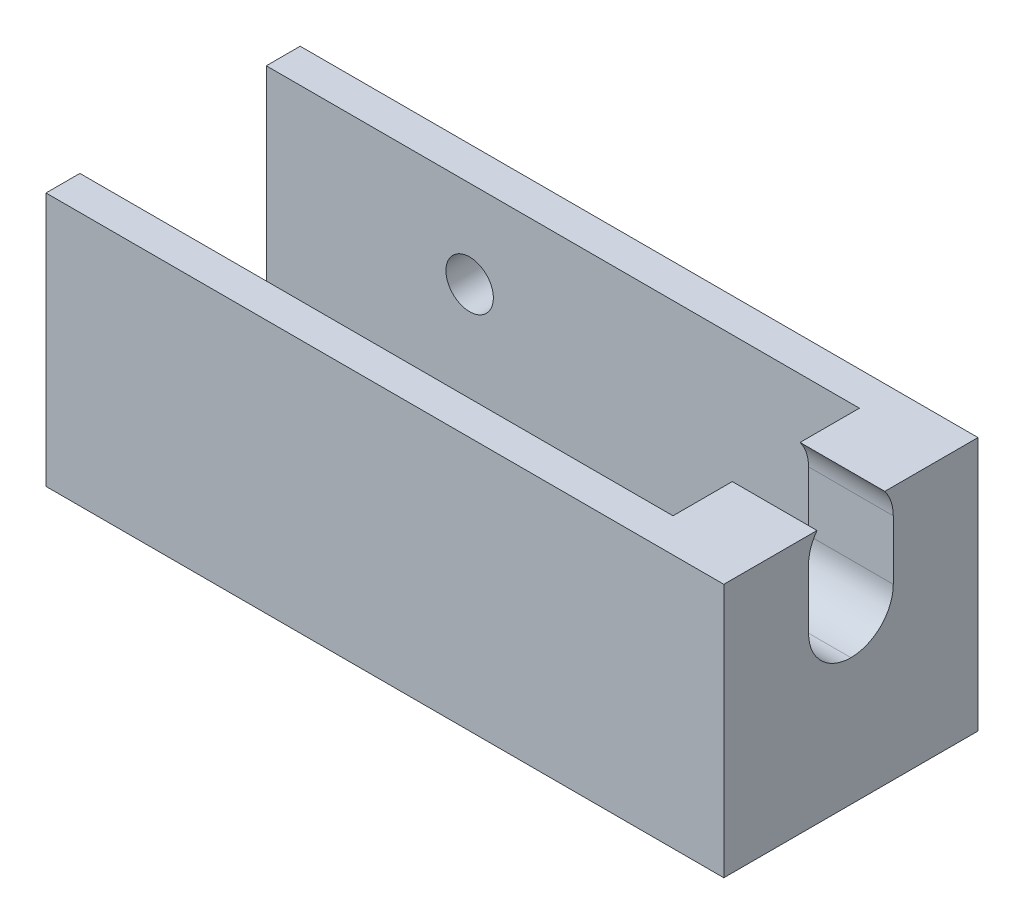
ISO-10303-21;
HEADER;
FILE_DESCRIPTION(('STEP AP214'),'2;1');
FILE_NAME('part.step','',(''),(''),'','','');
FILE_SCHEMA(('AUTOMOTIVE_DESIGN { 1 0 10303 214 1 1 1 1 }'));
ENDSEC;
DATA;
#1=APPLICATION_CONTEXT('core data for automotive mechanical design processes');
#2=APPLICATION_PROTOCOL_DEFINITION('international standard','automotive_design',2000,#1);
#3=PRODUCT_CONTEXT('',#1,'mechanical');
#4=PRODUCT('Part','Part','',(#3));
#5=PRODUCT_RELATED_PRODUCT_CATEGORY('part','',(#4));
#6=PRODUCT_DEFINITION_FORMATION('','',#4);
#7=PRODUCT_DEFINITION_CONTEXT('part definition',#1,'design');
#8=PRODUCT_DEFINITION('design','',#6,#7);
#9=PRODUCT_DEFINITION_SHAPE('','',#8);
#10=(LENGTH_UNIT() NAMED_UNIT(*) SI_UNIT(.MILLI.,.METRE.));
#11=(NAMED_UNIT(*) PLANE_ANGLE_UNIT() SI_UNIT($,.RADIAN.));
#12=(NAMED_UNIT(*) SI_UNIT($,.STERADIAN.) SOLID_ANGLE_UNIT());
#13=UNCERTAINTY_MEASURE_WITH_UNIT(LENGTH_MEASURE(1.E-05),#10,'distance_accuracy_value','');
#14=(GEOMETRIC_REPRESENTATION_CONTEXT(3) GLOBAL_UNCERTAINTY_ASSIGNED_CONTEXT((#13)) GLOBAL_UNIT_ASSIGNED_CONTEXT((#10,
#11,#12)) REPRESENTATION_CONTEXT('',''));
#15=CARTESIAN_POINT('',(0.,0.,0.));
#16=DIRECTION('',(0.,0.,1.));
#17=DIRECTION('',(1.,0.,0.));
#18=AXIS2_PLACEMENT_3D('',#15,#16,#17);
#19=CARTESIAN_POINT('',(15.,10.,0.));
#20=DIRECTION('',(1.,0.,0.));
#21=DIRECTION('',(0.,0.,-1.));
#22=AXIS2_PLACEMENT_3D('',#19,#20,#21);
#23=CYLINDRICAL_SURFACE('',#22,2.5);
#24=DIRECTION('',(-1.,0.,0.));
#25=VECTOR('',#24,1.);
#26=CARTESIAN_POINT('',(15.,10.,2.5));
#27=LINE('',#26,#25);
#28=CARTESIAN_POINT('',(20.,10.,2.5));
#29=VERTEX_POINT('',#28);
#30=CARTESIAN_POINT('',(15.,10.,2.5));
#31=VERTEX_POINT('',#30);
#32=EDGE_CURVE('E293',#29,#31,#27,.T.);
#33=ORIENTED_EDGE('',*,*,#32,.F.);
#34=CARTESIAN_POINT('',(20.,10.,0.));
#35=DIRECTION('',(-1.,0.,0.));
#36=DIRECTION('',(0.,0.,1.));
#37=AXIS2_PLACEMENT_3D('',#34,#35,#36);
#38=CIRCLE('',#37,2.5);
#39=CARTESIAN_POINT('',(20.,7.5,0.));
#40=VERTEX_POINT('',#39);
#41=EDGE_CURVE('E47',#29,#40,#38,.F.);
#42=ORIENTED_EDGE('',*,*,#41,.T.);
#43=DIRECTION('',(1.,0.,0.));
#44=VECTOR('',#43,1.);
#45=CARTESIAN_POINT('',(15.,7.5,0.));
#46=LINE('',#45,#44);
#47=CARTESIAN_POINT('',(15.,7.5,0.));
#48=VERTEX_POINT('',#47);
#49=EDGE_CURVE('E283',#40,#48,#46,.F.);
#50=ORIENTED_EDGE('',*,*,#49,.T.);
#51=CARTESIAN_POINT('',(15.,10.,0.));
#52=DIRECTION('',(1.,0.,0.));
#53=DIRECTION('',(0.,0.,-1.));
#54=AXIS2_PLACEMENT_3D('',#51,#52,#53);
#55=CIRCLE('',#54,2.5);
#56=EDGE_CURVE('E11',#48,#31,#55,.F.);
#57=ORIENTED_EDGE('',*,*,#56,.T.);
#58=EDGE_LOOP('',(#33,#42,#50,#57));
#59=FACE_BOUND('',#58,.T.);
#60=ADVANCED_FACE('F38',(#59),#23,.F.);
#61=CARTESIAN_POINT('',(15.,10.,0.));
#62=DIRECTION('',(-1.,0.,0.));
#63=DIRECTION('',(0.,0.,1.));
#64=AXIS2_PLACEMENT_3D('',#61,#62,#63);
#65=CYLINDRICAL_SURFACE('',#64,2.5);
#66=DIRECTION('',(1.,0.,0.));
#67=VECTOR('',#66,1.);
#68=CARTESIAN_POINT('',(15.,10.,-2.5));
#69=LINE('',#68,#67);
#70=CARTESIAN_POINT('',(15.,10.,-2.5));
#71=VERTEX_POINT('',#70);
#72=CARTESIAN_POINT('',(20.,10.,-2.5));
#73=VERTEX_POINT('',#72);
#74=EDGE_CURVE('E279',#71,#73,#69,.T.);
#75=ORIENTED_EDGE('',*,*,#74,.F.);
#76=CARTESIAN_POINT('',(15.,10.,0.));
#77=DIRECTION('',(1.,0.,0.));
#78=DIRECTION('',(0.,0.,-1.));
#79=AXIS2_PLACEMENT_3D('',#76,#77,#78);
#80=CIRCLE('',#79,2.5);
#81=EDGE_CURVE('E286',#71,#48,#80,.F.);
#82=ORIENTED_EDGE('',*,*,#81,.T.);
#83=ORIENTED_EDGE('',*,*,#49,.F.);
#84=CARTESIAN_POINT('',(20.,10.,0.));
#85=DIRECTION('',(-1.,0.,0.));
#86=DIRECTION('',(0.,0.,1.));
#87=AXIS2_PLACEMENT_3D('',#84,#85,#86);
#88=CIRCLE('',#87,2.5);
#89=EDGE_CURVE('E290',#40,#73,#88,.F.);
#90=ORIENTED_EDGE('',*,*,#89,.T.);
#91=EDGE_LOOP('',(#75,#82,#83,#90));
#92=FACE_BOUND('',#91,.T.);
#93=ADVANCED_FACE('F303',(#92),#65,.F.);
#94=CARTESIAN_POINT('',(0.,15.,0.));
#95=DIRECTION('',(0.,-1.,0.));
#96=DIRECTION('',(0.,0.,-1.));
#97=AXIS2_PLACEMENT_3D('',#94,#95,#96);
#98=PLANE('',#97);
#99=DIRECTION('',(1.,0.,0.));
#100=VECTOR('',#99,1.);
#101=CARTESIAN_POINT('',(15.,15.,2.));
#102=LINE('',#101,#100);
#103=CARTESIAN_POINT('',(20.,15.,2.));
#104=VERTEX_POINT('',#103);
#105=CARTESIAN_POINT('',(15.,15.,2.));
#106=VERTEX_POINT('',#105);
#107=EDGE_CURVE('E271',#104,#106,#102,.F.);
#108=ORIENTED_EDGE('',*,*,#107,.T.);
#109=DIRECTION('',(0.,0.,-1.));
#110=VECTOR('',#109,1.);
#111=CARTESIAN_POINT('',(15.,15.,-2.));
#112=LINE('',#111,#110);
#113=CARTESIAN_POINT('',(15.,15.,5.5));
#114=VERTEX_POINT('',#113);
#115=EDGE_CURVE('E156',#114,#106,#112,.T.);
#116=ORIENTED_EDGE('',*,*,#115,.F.);
#117=DIRECTION('',(1.,0.,0.));
#118=VECTOR('',#117,1.);
#119=CARTESIAN_POINT('',(-18.,15.,5.5));
#120=LINE('',#119,#118);
#121=CARTESIAN_POINT('',(-20.,15.,5.5));
#122=VERTEX_POINT('',#121);
#123=EDGE_CURVE('E182',#122,#114,#120,.T.);
#124=ORIENTED_EDGE('',*,*,#123,.F.);
#125=DIRECTION('',(0.,0.,1.));
#126=VECTOR('',#125,1.);
#127=CARTESIAN_POINT('',(-20.,15.,7.5));
#128=LINE('',#127,#126);
#129=CARTESIAN_POINT('',(-20.,15.,7.5));
#130=VERTEX_POINT('',#129);
#131=EDGE_CURVE('E236',#122,#130,#128,.T.);
#132=ORIENTED_EDGE('',*,*,#131,.T.);
#133=DIRECTION('',(1.,0.,0.));
#134=VECTOR('',#133,1.);
#135=CARTESIAN_POINT('',(-20.,15.,7.5));
#136=LINE('',#135,#134);
#137=CARTESIAN_POINT('',(20.,15.,7.5));
#138=VERTEX_POINT('',#137);
#139=EDGE_CURVE('E240',#130,#138,#136,.T.);
#140=ORIENTED_EDGE('',*,*,#139,.T.);
#141=DIRECTION('',(0.,0.,-1.));
#142=VECTOR('',#141,1.);
#143=CARTESIAN_POINT('',(20.,15.,7.5));
#144=LINE('',#143,#142);
#145=EDGE_CURVE('E228',#138,#104,#144,.T.);
#146=ORIENTED_EDGE('',*,*,#145,.T.);
#147=EDGE_LOOP('',(#108,#116,#124,#132,#140,#146));
#148=FACE_BOUND('',#147,.T.);
#149=ADVANCED_FACE('F318',(#148),#98,.F.);
#150=CARTESIAN_POINT('',(20.,15.,7.5));
#151=DIRECTION('',(-1.,0.,0.));
#152=DIRECTION('',(0.,0.,1.));
#153=AXIS2_PLACEMENT_3D('',#150,#151,#152);
#154=PLANE('',#153);
#155=DIRECTION('',(0.,-1.,0.));
#156=VECTOR('',#155,1.);
#157=CARTESIAN_POINT('',(20.,13.5,2.5));
#158=LINE('',#157,#156);
#159=CARTESIAN_POINT('',(20.,13.5,2.5));
#160=VERTEX_POINT('',#159);
#161=EDGE_CURVE('E213',#160,#29,#158,.T.);
#162=ORIENTED_EDGE('',*,*,#161,.F.);
#163=CARTESIAN_POINT('',(20.,13.5,0.));
#164=DIRECTION('',(1.,0.,0.));
#165=DIRECTION('',(0.,0.,-1.));
#166=AXIS2_PLACEMENT_3D('',#163,#164,#165);
#167=CIRCLE('',#166,2.5);
#168=EDGE_CURVE('E192',#104,#160,#167,.T.);
#169=ORIENTED_EDGE('',*,*,#168,.F.);
#170=ORIENTED_EDGE('',*,*,#145,.F.);
#171=DIRECTION('',(0.,-1.,0.));
#172=VECTOR('',#171,1.);
#173=CARTESIAN_POINT('',(20.,15.,7.5));
#174=LINE('',#173,#172);
#175=CARTESIAN_POINT('',(20.,0.,7.5));
#176=VERTEX_POINT('',#175);
#177=EDGE_CURVE('E243',#138,#176,#174,.T.);
#178=ORIENTED_EDGE('',*,*,#177,.T.);
#179=DIRECTION('',(0.,0.,-1.));
#180=VECTOR('',#179,1.);
#181=CARTESIAN_POINT('',(20.,0.,7.5));
#182=LINE('',#181,#180);
#183=CARTESIAN_POINT('',(20.,0.,-7.5));
#184=VERTEX_POINT('',#183);
#185=EDGE_CURVE('E224',#176,#184,#182,.T.);
#186=ORIENTED_EDGE('',*,*,#185,.T.);
#187=DIRECTION('',(0.,-1.,0.));
#188=VECTOR('',#187,1.);
#189=CARTESIAN_POINT('',(20.,15.,-7.5));
#190=LINE('',#189,#188);
#191=CARTESIAN_POINT('',(20.,15.,-7.5));
#192=VERTEX_POINT('',#191);
#193=EDGE_CURVE('E267',#192,#184,#190,.T.);
#194=ORIENTED_EDGE('',*,*,#193,.F.);
#195=CARTESIAN_POINT('',(20.,15.,-2.));
#196=VERTEX_POINT('',#195);
#197=EDGE_CURVE('E233',#196,#192,#144,.T.);
#198=ORIENTED_EDGE('',*,*,#197,.F.);
#199=CARTESIAN_POINT('',(20.,13.5,-2.5));
#200=VERTEX_POINT('',#199);
#201=EDGE_CURVE('E210',#200,#196,#167,.T.);
#202=ORIENTED_EDGE('',*,*,#201,.F.);
#203=DIRECTION('',(0.,1.,0.));
#204=VECTOR('',#203,1.);
#205=CARTESIAN_POINT('',(20.,7.5,-2.50000000000001));
#206=LINE('',#205,#204);
#207=EDGE_CURVE('E217',#73,#200,#206,.T.);
#208=ORIENTED_EDGE('',*,*,#207,.F.);
#209=ORIENTED_EDGE('',*,*,#89,.F.);
#210=ORIENTED_EDGE('',*,*,#41,.F.);
#211=EDGE_LOOP('',(#162,#169,#170,#178,#186,#194,#198,#202,#208,#209,#210));
#212=FACE_BOUND('',#211,.T.);
#213=ADVANCED_FACE('F299',(#212),#154,.F.);
#214=CARTESIAN_POINT('',(-20.,15.,-7.5));
#215=DIRECTION('',(0.,0.,1.));
#216=DIRECTION('',(1.,0.,0.));
#217=AXIS2_PLACEMENT_3D('',#214,#215,#216);
#218=PLANE('',#217);
#219=CARTESIAN_POINT('',(-8.,9.83148807816108,-7.49999999999999));
#220=DIRECTION('',(0.,0.,-1.));
#221=DIRECTION('',(-1.,0.,0.));
#222=AXIS2_PLACEMENT_3D('',#219,#220,#221);
#223=CIRCLE('',#222,1.4);
#224=CARTESIAN_POINT('',(-9.4,9.83148807816108,-7.49999999999999));
#225=VERTEX_POINT('',#224);
#226=EDGE_CURVE('E494',#225,#225,#223,.T.);
#227=ORIENTED_EDGE('',*,*,#226,.F.);
#228=EDGE_LOOP('',(#227));
#229=FACE_BOUND('',#228,.T.);
#230=DIRECTION('',(-1.,0.,0.));
#231=VECTOR('',#230,1.);
#232=CARTESIAN_POINT('',(-20.,0.,-7.5));
#233=LINE('',#232,#231);
#234=CARTESIAN_POINT('',(-20.,0.,-7.5));
#235=VERTEX_POINT('',#234);
#236=EDGE_CURVE('E247',#184,#235,#233,.T.);
#237=ORIENTED_EDGE('',*,*,#236,.T.);
#238=DIRECTION('',(0.,-1.,0.));
#239=VECTOR('',#238,1.);
#240=CARTESIAN_POINT('',(-20.,15.,-7.5));
#241=LINE('',#240,#239);
#242=CARTESIAN_POINT('',(-20.,15.,-7.5));
#243=VERTEX_POINT('',#242);
#244=EDGE_CURVE('E263',#243,#235,#241,.T.);
#245=ORIENTED_EDGE('',*,*,#244,.F.);
#246=DIRECTION('',(-1.,0.,0.));
#247=VECTOR('',#246,1.);
#248=CARTESIAN_POINT('',(-20.,15.,-7.5));
#249=LINE('',#248,#247);
#250=EDGE_CURVE('E232',#192,#243,#249,.T.);
#251=ORIENTED_EDGE('',*,*,#250,.F.);
#252=ORIENTED_EDGE('',*,*,#193,.T.);
#253=EDGE_LOOP('',(#237,#245,#251,#252));
#254=FACE_BOUND('',#253,.T.);
#255=ADVANCED_FACE('F335',(#229,#254),#218,.F.);
#256=CARTESIAN_POINT('',(-20.,15.,7.5));
#257=DIRECTION('',(1.,0.,0.));
#258=DIRECTION('',(0.,0.,-1.));
#259=AXIS2_PLACEMENT_3D('',#256,#257,#258);
#260=PLANE('',#259);
#261=ORIENTED_EDGE('',*,*,#131,.F.);
#262=DIRECTION('',(0.,1.,0.));
#263=VECTOR('',#262,1.);
#264=CARTESIAN_POINT('',(-20.,2.,5.5));
#265=LINE('',#264,#263);
#266=CARTESIAN_POINT('',(-20.,2.,5.5));
#267=VERTEX_POINT('',#266);
#268=EDGE_CURVE('E167',#267,#122,#265,.T.);
#269=ORIENTED_EDGE('',*,*,#268,.F.);
#270=DIRECTION('',(0.,0.,1.));
#271=VECTOR('',#270,1.);
#272=CARTESIAN_POINT('',(-20.,2.,-5.5));
#273=LINE('',#272,#271);
#274=CARTESIAN_POINT('',(-20.,2.,-5.5));
#275=VERTEX_POINT('',#274);
#276=EDGE_CURVE('E148',#275,#267,#273,.T.);
#277=ORIENTED_EDGE('',*,*,#276,.F.);
#278=DIRECTION('',(0.,1.,0.));
#279=VECTOR('',#278,1.);
#280=CARTESIAN_POINT('',(-20.,2.,-5.5));
#281=LINE('',#280,#279);
#282=CARTESIAN_POINT('',(-20.,15.,-5.5));
#283=VERTEX_POINT('',#282);
#284=EDGE_CURVE('E159',#275,#283,#281,.T.);
#285=ORIENTED_EDGE('',*,*,#284,.T.);
#286=EDGE_CURVE('E237',#243,#283,#128,.T.);
#287=ORIENTED_EDGE('',*,*,#286,.F.);
#288=ORIENTED_EDGE('',*,*,#244,.T.);
#289=DIRECTION('',(0.,0.,1.));
#290=VECTOR('',#289,1.);
#291=CARTESIAN_POINT('',(-20.,0.,7.5));
#292=LINE('',#291,#290);
#293=CARTESIAN_POINT('',(-20.,0.,7.5));
#294=VERTEX_POINT('',#293);
#295=EDGE_CURVE('E250',#235,#294,#292,.T.);
#296=ORIENTED_EDGE('',*,*,#295,.T.);
#297=DIRECTION('',(0.,-1.,0.));
#298=VECTOR('',#297,1.);
#299=CARTESIAN_POINT('',(-20.,15.,7.5));
#300=LINE('',#299,#298);
#301=EDGE_CURVE('E259',#130,#294,#300,.T.);
#302=ORIENTED_EDGE('',*,*,#301,.F.);
#303=EDGE_LOOP('',(#261,#269,#277,#285,#287,#288,#296,#302));
#304=FACE_BOUND('',#303,.T.);
#305=ADVANCED_FACE('F170',(#304),#260,.F.);
#306=CARTESIAN_POINT('',(-20.,15.,7.5));
#307=DIRECTION('',(0.,0.,-1.));
#308=DIRECTION('',(-1.,0.,0.));
#309=AXIS2_PLACEMENT_3D('',#306,#307,#308);
#310=PLANE('',#309);
#311=DIRECTION('',(1.,0.,0.));
#312=VECTOR('',#311,1.);
#313=CARTESIAN_POINT('',(-20.,0.,7.5));
#314=LINE('',#313,#312);
#315=EDGE_CURVE('E253',#294,#176,#314,.T.);
#316=ORIENTED_EDGE('',*,*,#315,.T.);
#317=ORIENTED_EDGE('',*,*,#177,.F.);
#318=ORIENTED_EDGE('',*,*,#139,.F.);
#319=ORIENTED_EDGE('',*,*,#301,.T.);
#320=EDGE_LOOP('',(#316,#317,#318,#319));
#321=FACE_BOUND('',#320,.T.);
#322=ADVANCED_FACE('F325',(#321),#310,.F.);
#323=DIRECTION('',(-1.,0.,0.));
#324=VECTOR('',#323,1.);
#325=CARTESIAN_POINT('',(-18.,15.,-5.5));
#326=LINE('',#325,#324);
#327=CARTESIAN_POINT('',(15.,15.,-5.5));
#328=VERTEX_POINT('',#327);
#329=EDGE_CURVE('E162',#328,#283,#326,.T.);
#330=ORIENTED_EDGE('',*,*,#329,.F.);
#331=CARTESIAN_POINT('',(15.,15.,-2.));
#332=VERTEX_POINT('',#331);
#333=EDGE_CURVE('E186',#332,#328,#112,.T.);
#334=ORIENTED_EDGE('',*,*,#333,.F.);
#335=DIRECTION('',(1.,0.,0.));
#336=VECTOR('',#335,1.);
#337=CARTESIAN_POINT('',(15.,15.,-2.));
#338=LINE('',#337,#336);
#339=EDGE_CURVE('E275',#332,#196,#338,.T.);
#340=ORIENTED_EDGE('',*,*,#339,.T.);
#341=ORIENTED_EDGE('',*,*,#197,.T.);
#342=ORIENTED_EDGE('',*,*,#250,.T.);
#343=ORIENTED_EDGE('',*,*,#286,.T.);
#344=EDGE_LOOP('',(#330,#334,#340,#341,#342,#343));
#345=FACE_BOUND('',#344,.T.);
#346=ADVANCED_FACE('F341',(#345),#98,.F.);
#347=CARTESIAN_POINT('',(0.,0.,0.));
#348=DIRECTION('',(0.,-1.,0.));
#349=DIRECTION('',(0.,0.,-1.));
#350=AXIS2_PLACEMENT_3D('',#347,#348,#349);
#351=PLANE('',#350);
#352=CARTESIAN_POINT('',(-15.9327001413857,0.,0.));
#353=DIRECTION('',(0.,-1.,0.));
#354=DIRECTION('',(0.,0.,-1.));
#355=AXIS2_PLACEMENT_3D('',#352,#353,#354);
#356=CIRCLE('',#355,1.);
#357=CARTESIAN_POINT('',(-15.9327001413857,0.,-1.));
#358=VERTEX_POINT('',#357);
#359=EDGE_CURVE('E487',#358,#358,#356,.T.);
#360=ORIENTED_EDGE('',*,*,#359,.F.);
#361=EDGE_LOOP('',(#360));
#362=FACE_BOUND('',#361,.T.);
#363=ORIENTED_EDGE('',*,*,#185,.F.);
#364=ORIENTED_EDGE('',*,*,#315,.F.);
#365=ORIENTED_EDGE('',*,*,#295,.F.);
#366=ORIENTED_EDGE('',*,*,#236,.F.);
#367=EDGE_LOOP('',(#363,#364,#365,#366));
#368=FACE_BOUND('',#367,.T.);
#369=ADVANCED_FACE('F330',(#362,#368),#351,.T.);
#370=CARTESIAN_POINT('',(15.,13.5,0.));
#371=DIRECTION('',(1.,0.,0.));
#372=DIRECTION('',(0.,0.,-1.));
#373=AXIS2_PLACEMENT_3D('',#370,#371,#372);
#374=CYLINDRICAL_SURFACE('',#373,2.5);
#375=CARTESIAN_POINT('',(15.,13.5,0.));
#376=DIRECTION('',(1.,0.,0.));
#377=DIRECTION('',(0.,0.,-1.));
#378=AXIS2_PLACEMENT_3D('',#375,#376,#377);
#379=CIRCLE('',#378,2.5);
#380=CARTESIAN_POINT('',(15.,13.5,-2.5));
#381=VERTEX_POINT('',#380);
#382=EDGE_CURVE('E198',#381,#332,#379,.T.);
#383=ORIENTED_EDGE('',*,*,#382,.F.);
#384=DIRECTION('',(1.,0.,0.));
#385=VECTOR('',#384,1.);
#386=CARTESIAN_POINT('',(15.,13.5,-2.5));
#387=LINE('',#386,#385);
#388=EDGE_CURVE('E220',#381,#200,#387,.T.);
#389=ORIENTED_EDGE('',*,*,#388,.T.);
#390=ORIENTED_EDGE('',*,*,#201,.T.);
#391=ORIENTED_EDGE('',*,*,#339,.F.);
#392=EDGE_LOOP('',(#383,#389,#390,#391));
#393=FACE_BOUND('',#392,.T.);
#394=ADVANCED_FACE('F346',(#393),#374,.F.);
#395=ORIENTED_EDGE('',*,*,#168,.T.);
#396=DIRECTION('',(1.,0.,0.));
#397=VECTOR('',#396,1.);
#398=CARTESIAN_POINT('',(15.,13.5,2.5));
#399=LINE('',#398,#397);
#400=CARTESIAN_POINT('',(15.,13.5,2.5));
#401=VERTEX_POINT('',#400);
#402=EDGE_CURVE('E209',#401,#160,#399,.T.);
#403=ORIENTED_EDGE('',*,*,#402,.F.);
#404=EDGE_CURVE('E202',#106,#401,#379,.T.);
#405=ORIENTED_EDGE('',*,*,#404,.F.);
#406=ORIENTED_EDGE('',*,*,#107,.F.);
#407=EDGE_LOOP('',(#395,#403,#405,#406));
#408=FACE_BOUND('',#407,.T.);
#409=ADVANCED_FACE('F350',(#408),#374,.F.);
#410=CARTESIAN_POINT('',(15.,7.5,-2.50000000000001));
#411=DIRECTION('',(0.,0.,-1.));
#412=DIRECTION('',(0.,1.,0.));
#413=AXIS2_PLACEMENT_3D('',#410,#411,#412);
#414=PLANE('',#413);
#415=DIRECTION('',(0.,1.,0.));
#416=VECTOR('',#415,1.);
#417=CARTESIAN_POINT('',(15.,7.5,-2.50000000000001));
#418=LINE('',#417,#416);
#419=EDGE_CURVE('E206',#71,#381,#418,.T.);
#420=ORIENTED_EDGE('',*,*,#419,.F.);
#421=ORIENTED_EDGE('',*,*,#74,.T.);
#422=ORIENTED_EDGE('',*,*,#207,.T.);
#423=ORIENTED_EDGE('',*,*,#388,.F.);
#424=EDGE_LOOP('',(#420,#421,#422,#423));
#425=FACE_BOUND('',#424,.T.);
#426=ADVANCED_FACE('F348',(#425),#414,.F.);
#427=CARTESIAN_POINT('',(15.,13.5,2.5));
#428=DIRECTION('',(0.,0.,1.));
#429=DIRECTION('',(0.,-1.,0.));
#430=AXIS2_PLACEMENT_3D('',#427,#428,#429);
#431=PLANE('',#430);
#432=ORIENTED_EDGE('',*,*,#161,.T.);
#433=ORIENTED_EDGE('',*,*,#32,.T.);
#434=DIRECTION('',(0.,-1.,0.));
#435=VECTOR('',#434,1.);
#436=CARTESIAN_POINT('',(15.,13.5,2.5));
#437=LINE('',#436,#435);
#438=EDGE_CURVE('E201',#401,#31,#437,.T.);
#439=ORIENTED_EDGE('',*,*,#438,.F.);
#440=ORIENTED_EDGE('',*,*,#402,.T.);
#441=EDGE_LOOP('',(#432,#433,#439,#440));
#442=FACE_BOUND('',#441,.T.);
#443=ADVANCED_FACE('F312',(#442),#431,.F.);
#444=CARTESIAN_POINT('',(15.,2.,-2.));
#445=DIRECTION('',(1.,0.,0.));
#446=DIRECTION('',(0.,0.,-1.));
#447=AXIS2_PLACEMENT_3D('',#444,#445,#446);
#448=PLANE('',#447);
#449=ORIENTED_EDGE('',*,*,#56,.F.);
#450=ORIENTED_EDGE('',*,*,#81,.F.);
#451=ORIENTED_EDGE('',*,*,#419,.T.);
#452=ORIENTED_EDGE('',*,*,#382,.T.);
#453=ORIENTED_EDGE('',*,*,#333,.T.);
#454=DIRECTION('',(0.,1.,0.));
#455=VECTOR('',#454,1.);
#456=CARTESIAN_POINT('',(15.,2.,-5.5));
#457=LINE('',#456,#455);
#458=CARTESIAN_POINT('',(15.,2.,-5.5));
#459=VERTEX_POINT('',#458);
#460=EDGE_CURVE('E189',#459,#328,#457,.T.);
#461=ORIENTED_EDGE('',*,*,#460,.F.);
#462=DIRECTION('',(0.,0.,-1.));
#463=VECTOR('',#462,1.);
#464=CARTESIAN_POINT('',(15.,2.,5.5));
#465=LINE('',#464,#463);
#466=CARTESIAN_POINT('',(15.,2.,5.5));
#467=VERTEX_POINT('',#466);
#468=EDGE_CURVE('E151',#467,#459,#465,.T.);
#469=ORIENTED_EDGE('',*,*,#468,.F.);
#470=DIRECTION('',(0.,1.,0.));
#471=VECTOR('',#470,1.);
#472=CARTESIAN_POINT('',(15.,2.,5.5));
#473=LINE('',#472,#471);
#474=EDGE_CURVE('E193',#467,#114,#473,.T.);
#475=ORIENTED_EDGE('',*,*,#474,.T.);
#476=ORIENTED_EDGE('',*,*,#115,.T.);
#477=ORIENTED_EDGE('',*,*,#404,.T.);
#478=ORIENTED_EDGE('',*,*,#438,.T.);
#479=EDGE_LOOP('',(#449,#450,#451,#452,#453,#461,#469,#475,#476,#477,#478));
#480=FACE_BOUND('',#479,.T.);
#481=ADVANCED_FACE('F306',(#480),#448,.F.);
#482=CARTESIAN_POINT('',(-18.,2.,5.5));
#483=DIRECTION('',(0.,0.,1.));
#484=DIRECTION('',(1.,0.,0.));
#485=AXIS2_PLACEMENT_3D('',#482,#483,#484);
#486=PLANE('',#485);
#487=ORIENTED_EDGE('',*,*,#123,.T.);
#488=ORIENTED_EDGE('',*,*,#474,.F.);
#489=DIRECTION('',(1.,0.,0.));
#490=VECTOR('',#489,1.);
#491=CARTESIAN_POINT('',(-20.,2.,5.5));
#492=LINE('',#491,#490);
#493=EDGE_CURVE('E172',#267,#467,#492,.T.);
#494=ORIENTED_EDGE('',*,*,#493,.F.);
#495=ORIENTED_EDGE('',*,*,#268,.T.);
#496=EDGE_LOOP('',(#487,#488,#494,#495));
#497=FACE_BOUND('',#496,.T.);
#498=ADVANCED_FACE('F397',(#497),#486,.F.);
#499=CARTESIAN_POINT('',(-18.,2.,-5.5));
#500=DIRECTION('',(0.,0.,-1.));
#501=DIRECTION('',(-1.,0.,0.));
#502=AXIS2_PLACEMENT_3D('',#499,#500,#501);
#503=PLANE('',#502);
#504=CARTESIAN_POINT('',(-8.,9.83148807816108,-5.5));
#505=DIRECTION('',(0.,0.,-1.));
#506=DIRECTION('',(-1.,0.,0.));
#507=AXIS2_PLACEMENT_3D('',#504,#505,#506);
#508=CIRCLE('',#507,1.4);
#509=CARTESIAN_POINT('',(-9.4,9.83148807816108,-5.5));
#510=VERTEX_POINT('',#509);
#511=EDGE_CURVE('E41',#510,#510,#508,.T.);
#512=ORIENTED_EDGE('',*,*,#511,.T.);
#513=EDGE_LOOP('',(#512));
#514=FACE_BOUND('',#513,.T.);
#515=ORIENTED_EDGE('',*,*,#329,.T.);
#516=ORIENTED_EDGE('',*,*,#284,.F.);
#517=DIRECTION('',(-1.,0.,0.));
#518=VECTOR('',#517,1.);
#519=CARTESIAN_POINT('',(15.,2.,-5.5));
#520=LINE('',#519,#518);
#521=EDGE_CURVE('E144',#459,#275,#520,.T.);
#522=ORIENTED_EDGE('',*,*,#521,.F.);
#523=ORIENTED_EDGE('',*,*,#460,.T.);
#524=EDGE_LOOP('',(#515,#516,#522,#523));
#525=FACE_BOUND('',#524,.T.);
#526=ADVANCED_FACE('F160',(#514,#525),#503,.F.);
#527=CARTESIAN_POINT('',(0.,2.,0.));
#528=DIRECTION('',(0.,1.,0.));
#529=DIRECTION('',(0.,0.,1.));
#530=AXIS2_PLACEMENT_3D('',#527,#528,#529);
#531=PLANE('',#530);
#532=CARTESIAN_POINT('',(-15.9327001413857,2.,0.));
#533=DIRECTION('',(0.,1.,0.));
#534=DIRECTION('',(0.,0.,1.));
#535=AXIS2_PLACEMENT_3D('',#532,#533,#534);
#536=CIRCLE('',#535,1.);
#537=CARTESIAN_POINT('',(-15.9327001413857,2.,1.));
#538=VERTEX_POINT('',#537);
#539=EDGE_CURVE('E490',#538,#538,#536,.T.);
#540=ORIENTED_EDGE('',*,*,#539,.F.);
#541=EDGE_LOOP('',(#540));
#542=FACE_BOUND('',#541,.T.);
#543=ORIENTED_EDGE('',*,*,#521,.T.);
#544=ORIENTED_EDGE('',*,*,#276,.T.);
#545=ORIENTED_EDGE('',*,*,#493,.T.);
#546=ORIENTED_EDGE('',*,*,#468,.T.);
#547=EDGE_LOOP('',(#543,#544,#545,#546));
#548=FACE_BOUND('',#547,.T.);
#549=ADVANCED_FACE('F146',(#542,#548),#531,.T.);
#550=CARTESIAN_POINT('',(-8.,9.83148807816108,0.500000000000008));
#551=DIRECTION('',(0.,0.,-1.));
#552=DIRECTION('',(-1.,0.,0.));
#553=AXIS2_PLACEMENT_3D('',#550,#551,#552);
#554=CYLINDRICAL_SURFACE('',#553,1.4);
#555=ORIENTED_EDGE('',*,*,#226,.T.);
#556=EDGE_LOOP('',(#555));
#557=FACE_BOUND('',#556,.T.);
#558=ORIENTED_EDGE('',*,*,#511,.F.);
#559=EDGE_LOOP('',(#558));
#560=FACE_BOUND('',#559,.T.);
#561=ADVANCED_FACE('F460',(#557,#560),#554,.F.);
#562=CARTESIAN_POINT('',(-15.9327001413857,-8.,0.));
#563=DIRECTION('',(0.,1.,0.));
#564=DIRECTION('',(0.,0.,1.));
#565=AXIS2_PLACEMENT_3D('',#562,#563,#564);
#566=CYLINDRICAL_SURFACE('',#565,1.);
#567=ORIENTED_EDGE('',*,*,#359,.T.);
#568=EDGE_LOOP('',(#567));
#569=FACE_BOUND('',#568,.T.);
#570=ORIENTED_EDGE('',*,*,#539,.T.);
#571=EDGE_LOOP('',(#570));
#572=FACE_BOUND('',#571,.T.);
#573=ADVANCED_FACE('F463',(#569,#572),#566,.F.);
#574=CLOSED_SHELL('',(#60,#93,#149,#213,#255,#305,#322,#346,#369,#394,#409,#426,#443,#481,#498,
#526,#549,#561,#573));
#575=MANIFOLD_SOLID_BREP('B2',#574);
#576=ADVANCED_BREP_SHAPE_REPRESENTATION('',(#18,#575),#14);
#577=SHAPE_DEFINITION_REPRESENTATION(#9,#576);
ENDSEC;
END-ISO-10303-21;
